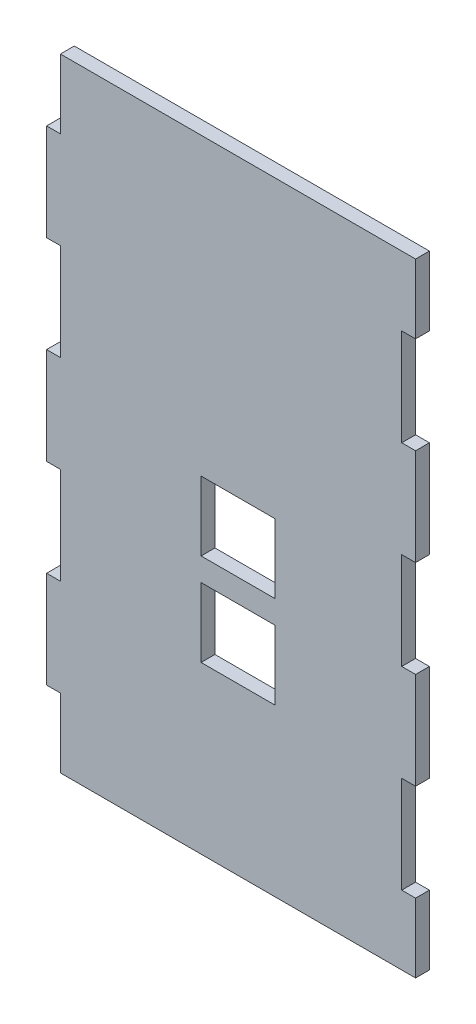
ISO-10303-21;
HEADER;
FILE_DESCRIPTION(('STEP AP214'),'2;1');
FILE_NAME('part.step','',(''),(''),'','','');
FILE_SCHEMA(('AUTOMOTIVE_DESIGN { 1 0 10303 214 1 1 1 1 }'));
ENDSEC;
DATA;
#1=APPLICATION_CONTEXT('core data for automotive mechanical design processes');
#2=APPLICATION_PROTOCOL_DEFINITION('international standard','automotive_design',2000,#1);
#3=PRODUCT_CONTEXT('',#1,'mechanical');
#4=PRODUCT('Part','Part','',(#3));
#5=PRODUCT_RELATED_PRODUCT_CATEGORY('part','',(#4));
#6=PRODUCT_DEFINITION_FORMATION('','',#4);
#7=PRODUCT_DEFINITION_CONTEXT('part definition',#1,'design');
#8=PRODUCT_DEFINITION('design','',#6,#7);
#9=PRODUCT_DEFINITION_SHAPE('','',#8);
#10=(LENGTH_UNIT() NAMED_UNIT(*) SI_UNIT(.MILLI.,.METRE.));
#11=(NAMED_UNIT(*) PLANE_ANGLE_UNIT() SI_UNIT($,.RADIAN.));
#12=(NAMED_UNIT(*) SI_UNIT($,.STERADIAN.) SOLID_ANGLE_UNIT());
#13=UNCERTAINTY_MEASURE_WITH_UNIT(LENGTH_MEASURE(1.E-05),#10,'distance_accuracy_value','');
#14=(GEOMETRIC_REPRESENTATION_CONTEXT(3) GLOBAL_UNCERTAINTY_ASSIGNED_CONTEXT((#13)) GLOBAL_UNIT_ASSIGNED_CONTEXT((#10,
#11,#12)) REPRESENTATION_CONTEXT('',''));
#15=CARTESIAN_POINT('',(0.,0.,0.));
#16=DIRECTION('',(0.,0.,1.));
#17=DIRECTION('',(1.,0.,0.));
#18=AXIS2_PLACEMENT_3D('',#15,#16,#17);
#19=CARTESIAN_POINT('',(-38.5,-67.5,3.));
#20=DIRECTION('',(1.,0.,0.));
#21=DIRECTION('',(0.,0.,-1.));
#22=AXIS2_PLACEMENT_3D('',#19,#20,#21);
#23=PLANE('',#22);
#24=DIRECTION('',(0.,-1.,0.));
#25=VECTOR('',#24,1.);
#26=CARTESIAN_POINT('',(-38.5,-67.5,3.));
#27=LINE('',#26,#25);
#28=CARTESIAN_POINT('',(-38.5,-52.5,3.));
#29=VERTEX_POINT('',#28);
#30=CARTESIAN_POINT('',(-38.5,-67.5,3.));
#31=VERTEX_POINT('',#30);
#32=EDGE_CURVE('E590',#29,#31,#27,.T.);
#33=ORIENTED_EDGE('',*,*,#32,.F.);
#34=DIRECTION('',(0.,0.,1.));
#35=VECTOR('',#34,1.);
#36=CARTESIAN_POINT('',(-38.5,-52.5,0.));
#37=LINE('',#36,#35);
#38=CARTESIAN_POINT('',(-38.5,-52.5,0.));
#39=VERTEX_POINT('',#38);
#40=EDGE_CURVE('E390',#39,#29,#37,.T.);
#41=ORIENTED_EDGE('',*,*,#40,.F.);
#42=DIRECTION('',(0.,-1.,0.));
#43=VECTOR('',#42,1.);
#44=CARTESIAN_POINT('',(-38.5,-67.5,0.));
#45=LINE('',#44,#43);
#46=CARTESIAN_POINT('',(-38.5,-67.5,0.));
#47=VERTEX_POINT('',#46);
#48=EDGE_CURVE('E505',#39,#47,#45,.T.);
#49=ORIENTED_EDGE('',*,*,#48,.T.);
#50=DIRECTION('',(0.,0.,-1.));
#51=VECTOR('',#50,1.);
#52=CARTESIAN_POINT('',(-38.5,-67.5,3.));
#53=LINE('',#52,#51);
#54=EDGE_CURVE('E11',#31,#47,#53,.T.);
#55=ORIENTED_EDGE('',*,*,#54,.F.);
#56=EDGE_LOOP('',(#33,#41,#49,#55));
#57=FACE_BOUND('',#56,.T.);
#58=ADVANCED_FACE('F42',(#57),#23,.F.);
#59=CARTESIAN_POINT('',(-38.5,-10.5,0.));
#60=VERTEX_POINT('',#59);
#61=CARTESIAN_POINT('',(-38.5,-31.5,0.));
#62=VERTEX_POINT('',#61);
#63=EDGE_CURVE('E655',#60,#62,#45,.T.);
#64=ORIENTED_EDGE('',*,*,#63,.T.);
#65=DIRECTION('',(0.,0.,1.));
#66=VECTOR('',#65,1.);
#67=CARTESIAN_POINT('',(-38.5,-31.5,0.));
#68=LINE('',#67,#66);
#69=CARTESIAN_POINT('',(-38.5,-31.5,3.));
#70=VERTEX_POINT('',#69);
#71=EDGE_CURVE('E379',#62,#70,#68,.T.);
#72=ORIENTED_EDGE('',*,*,#71,.T.);
#73=CARTESIAN_POINT('',(-38.5,-10.5,3.));
#74=VERTEX_POINT('',#73);
#75=EDGE_CURVE('E681',#74,#70,#27,.T.);
#76=ORIENTED_EDGE('',*,*,#75,.F.);
#77=DIRECTION('',(0.,0.,1.));
#78=VECTOR('',#77,1.);
#79=CARTESIAN_POINT('',(-38.5,-10.5,0.));
#80=LINE('',#79,#78);
#81=EDGE_CURVE('E427',#60,#74,#80,.T.);
#82=ORIENTED_EDGE('',*,*,#81,.F.);
#83=EDGE_LOOP('',(#64,#72,#76,#82));
#84=FACE_BOUND('',#83,.T.);
#85=ADVANCED_FACE('F757',(#84),#23,.F.);
#86=CARTESIAN_POINT('',(-38.5,31.5,0.));
#87=VERTEX_POINT('',#86);
#88=CARTESIAN_POINT('',(-38.5,10.5,0.));
#89=VERTEX_POINT('',#88);
#90=EDGE_CURVE('E608',#87,#89,#45,.T.);
#91=ORIENTED_EDGE('',*,*,#90,.T.);
#92=DIRECTION('',(0.,0.,1.));
#93=VECTOR('',#92,1.);
#94=CARTESIAN_POINT('',(-38.5,10.5,0.));
#95=LINE('',#94,#93);
#96=CARTESIAN_POINT('',(-38.5,10.5,3.));
#97=VERTEX_POINT('',#96);
#98=EDGE_CURVE('E416',#89,#97,#95,.T.);
#99=ORIENTED_EDGE('',*,*,#98,.T.);
#100=CARTESIAN_POINT('',(-38.5,31.5,3.));
#101=VERTEX_POINT('',#100);
#102=EDGE_CURVE('E589',#101,#97,#27,.T.);
#103=ORIENTED_EDGE('',*,*,#102,.F.);
#104=DIRECTION('',(0.,0.,1.));
#105=VECTOR('',#104,1.);
#106=CARTESIAN_POINT('',(-38.5,31.5,0.));
#107=LINE('',#106,#105);
#108=EDGE_CURVE('E463',#87,#101,#107,.T.);
#109=ORIENTED_EDGE('',*,*,#108,.F.);
#110=EDGE_LOOP('',(#91,#99,#103,#109));
#111=FACE_BOUND('',#110,.T.);
#112=ADVANCED_FACE('F665',(#111),#23,.F.);
#113=CARTESIAN_POINT('',(38.5,-67.5,3.));
#114=DIRECTION('',(-1.,0.,0.));
#115=DIRECTION('',(0.,0.,1.));
#116=AXIS2_PLACEMENT_3D('',#113,#114,#115);
#117=PLANE('',#116);
#118=DIRECTION('',(0.,1.,0.));
#119=VECTOR('',#118,1.);
#120=CARTESIAN_POINT('',(38.5,-67.5,0.));
#121=LINE('',#120,#119);
#122=CARTESIAN_POINT('',(38.5,10.5,0.));
#123=VERTEX_POINT('',#122);
#124=CARTESIAN_POINT('',(38.5,31.5,0.));
#125=VERTEX_POINT('',#124);
#126=EDGE_CURVE('E689',#123,#125,#121,.T.);
#127=ORIENTED_EDGE('',*,*,#126,.T.);
#128=DIRECTION('',(0.,0.,1.));
#129=VECTOR('',#128,1.);
#130=CARTESIAN_POINT('',(38.5,31.5,0.));
#131=LINE('',#130,#129);
#132=CARTESIAN_POINT('',(38.5,31.5,3.));
#133=VERTEX_POINT('',#132);
#134=EDGE_CURVE('E501',#125,#133,#131,.T.);
#135=ORIENTED_EDGE('',*,*,#134,.T.);
#136=DIRECTION('',(0.,1.,0.));
#137=VECTOR('',#136,1.);
#138=CARTESIAN_POINT('',(38.5,-67.5,3.));
#139=LINE('',#138,#137);
#140=CARTESIAN_POINT('',(38.5,10.5,3.));
#141=VERTEX_POINT('',#140);
#142=EDGE_CURVE('E711',#141,#133,#139,.T.);
#143=ORIENTED_EDGE('',*,*,#142,.F.);
#144=DIRECTION('',(0.,0.,1.));
#145=VECTOR('',#144,1.);
#146=CARTESIAN_POINT('',(38.5,10.5,0.));
#147=LINE('',#146,#145);
#148=EDGE_CURVE('E495',#123,#141,#147,.T.);
#149=ORIENTED_EDGE('',*,*,#148,.F.);
#150=EDGE_LOOP('',(#127,#135,#143,#149));
#151=FACE_BOUND('',#150,.T.);
#152=ADVANCED_FACE('F735',(#151),#117,.F.);
#153=CARTESIAN_POINT('',(38.5,52.5,3.));
#154=VERTEX_POINT('',#153);
#155=CARTESIAN_POINT('',(38.5,67.5,3.));
#156=VERTEX_POINT('',#155);
#157=EDGE_CURVE('E593',#154,#156,#139,.T.);
#158=ORIENTED_EDGE('',*,*,#157,.F.);
#159=DIRECTION('',(0.,0.,1.));
#160=VECTOR('',#159,1.);
#161=CARTESIAN_POINT('',(38.5,52.5,0.));
#162=LINE('',#161,#160);
#163=CARTESIAN_POINT('',(38.5,52.5,0.));
#164=VERTEX_POINT('',#163);
#165=EDGE_CURVE('E489',#164,#154,#162,.T.);
#166=ORIENTED_EDGE('',*,*,#165,.F.);
#167=CARTESIAN_POINT('',(38.5,67.5,0.));
#168=VERTEX_POINT('',#167);
#169=EDGE_CURVE('E611',#164,#168,#121,.T.);
#170=ORIENTED_EDGE('',*,*,#169,.T.);
#171=DIRECTION('',(0.,0.,-1.));
#172=VECTOR('',#171,1.);
#173=CARTESIAN_POINT('',(38.5,67.5,3.));
#174=LINE('',#173,#172);
#175=EDGE_CURVE('E623',#156,#168,#174,.T.);
#176=ORIENTED_EDGE('',*,*,#175,.F.);
#177=EDGE_LOOP('',(#158,#166,#170,#176));
#178=FACE_BOUND('',#177,.T.);
#179=ADVANCED_FACE('F697',(#178),#117,.F.);
#180=CARTESIAN_POINT('',(38.5,-31.5,0.));
#181=VERTEX_POINT('',#180);
#182=CARTESIAN_POINT('',(38.5,-10.5,0.));
#183=VERTEX_POINT('',#182);
#184=EDGE_CURVE('E617',#181,#183,#121,.T.);
#185=ORIENTED_EDGE('',*,*,#184,.T.);
#186=DIRECTION('',(0.,0.,1.));
#187=VECTOR('',#186,1.);
#188=CARTESIAN_POINT('',(38.5,-10.5,0.));
#189=LINE('',#188,#187);
#190=CARTESIAN_POINT('',(38.5,-10.5,3.));
#191=VERTEX_POINT('',#190);
#192=EDGE_CURVE('E541',#183,#191,#189,.T.);
#193=ORIENTED_EDGE('',*,*,#192,.T.);
#194=CARTESIAN_POINT('',(38.5,-31.5,3.));
#195=VERTEX_POINT('',#194);
#196=EDGE_CURVE('E599',#195,#191,#139,.T.);
#197=ORIENTED_EDGE('',*,*,#196,.F.);
#198=DIRECTION('',(0.,0.,1.));
#199=VECTOR('',#198,1.);
#200=CARTESIAN_POINT('',(38.5,-31.5,0.));
#201=LINE('',#200,#199);
#202=EDGE_CURVE('E533',#181,#195,#201,.T.);
#203=ORIENTED_EDGE('',*,*,#202,.F.);
#204=EDGE_LOOP('',(#185,#193,#197,#203));
#205=FACE_BOUND('',#204,.T.);
#206=ADVANCED_FACE('F723',(#205),#117,.F.);
#207=CARTESIAN_POINT('',(-38.5,67.5,0.));
#208=VERTEX_POINT('',#207);
#209=CARTESIAN_POINT('',(-38.5,52.5,0.));
#210=VERTEX_POINT('',#209);
#211=EDGE_CURVE('E603',#208,#210,#45,.T.);
#212=ORIENTED_EDGE('',*,*,#211,.T.);
#213=DIRECTION('',(0.,0.,1.));
#214=VECTOR('',#213,1.);
#215=CARTESIAN_POINT('',(-38.5,52.5,0.));
#216=LINE('',#215,#214);
#217=CARTESIAN_POINT('',(-38.5,52.5,3.));
#218=VERTEX_POINT('',#217);
#219=EDGE_CURVE('E452',#210,#218,#216,.T.);
#220=ORIENTED_EDGE('',*,*,#219,.T.);
#221=CARTESIAN_POINT('',(-38.5,67.5,3.));
#222=VERTEX_POINT('',#221);
#223=EDGE_CURVE('E584',#222,#218,#27,.T.);
#224=ORIENTED_EDGE('',*,*,#223,.F.);
#225=DIRECTION('',(0.,0.,-1.));
#226=VECTOR('',#225,1.);
#227=CARTESIAN_POINT('',(-38.5,67.5,3.));
#228=LINE('',#227,#226);
#229=EDGE_CURVE('E602',#222,#208,#228,.T.);
#230=ORIENTED_EDGE('',*,*,#229,.T.);
#231=EDGE_LOOP('',(#212,#220,#224,#230));
#232=FACE_BOUND('',#231,.T.);
#233=ADVANCED_FACE('F44',(#232),#23,.F.);
#234=CARTESIAN_POINT('',(38.5,-67.5,3.));
#235=DIRECTION('',(0.,1.,0.));
#236=DIRECTION('',(-1.,0.,0.));
#237=AXIS2_PLACEMENT_3D('',#234,#235,#236);
#238=PLANE('',#237);
#239=DIRECTION('',(1.,0.,0.));
#240=VECTOR('',#239,1.);
#241=CARTESIAN_POINT('',(38.5,-67.5,0.));
#242=LINE('',#241,#240);
#243=CARTESIAN_POINT('',(38.5,-67.5,0.));
#244=VERTEX_POINT('',#243);
#245=EDGE_CURVE('E607',#47,#244,#242,.T.);
#246=ORIENTED_EDGE('',*,*,#245,.T.);
#247=DIRECTION('',(0.,0.,-1.));
#248=VECTOR('',#247,1.);
#249=CARTESIAN_POINT('',(38.5,-67.5,3.));
#250=LINE('',#249,#248);
#251=CARTESIAN_POINT('',(38.5,-67.5,3.));
#252=VERTEX_POINT('',#251);
#253=EDGE_CURVE('E51',#252,#244,#250,.T.);
#254=ORIENTED_EDGE('',*,*,#253,.F.);
#255=DIRECTION('',(1.,0.,0.));
#256=VECTOR('',#255,1.);
#257=CARTESIAN_POINT('',(38.5,-67.5,3.));
#258=LINE('',#257,#256);
#259=EDGE_CURVE('E588',#31,#252,#258,.T.);
#260=ORIENTED_EDGE('',*,*,#259,.F.);
#261=ORIENTED_EDGE('',*,*,#54,.T.);
#262=EDGE_LOOP('',(#246,#254,#260,#261));
#263=FACE_BOUND('',#262,.T.);
#264=ADVANCED_FACE('F650',(#263),#238,.F.);
#265=CARTESIAN_POINT('',(38.5,-52.5,0.));
#266=VERTEX_POINT('',#265);
#267=EDGE_CURVE('E612',#244,#266,#121,.T.);
#268=ORIENTED_EDGE('',*,*,#267,.T.);
#269=DIRECTION('',(0.,0.,1.));
#270=VECTOR('',#269,1.);
#271=CARTESIAN_POINT('',(38.5,-52.5,0.));
#272=LINE('',#271,#270);
#273=CARTESIAN_POINT('',(38.5,-52.5,3.));
#274=VERTEX_POINT('',#273);
#275=EDGE_CURVE('E575',#266,#274,#272,.T.);
#276=ORIENTED_EDGE('',*,*,#275,.T.);
#277=EDGE_CURVE('E594',#252,#274,#139,.T.);
#278=ORIENTED_EDGE('',*,*,#277,.F.);
#279=ORIENTED_EDGE('',*,*,#253,.T.);
#280=EDGE_LOOP('',(#268,#276,#278,#279));
#281=FACE_BOUND('',#280,.T.);
#282=ADVANCED_FACE('F632',(#281),#117,.F.);
#283=CARTESIAN_POINT('',(38.5,67.5,3.));
#284=DIRECTION('',(0.,-1.,0.));
#285=DIRECTION('',(1.,0.,0.));
#286=AXIS2_PLACEMENT_3D('',#283,#284,#285);
#287=PLANE('',#286);
#288=DIRECTION('',(-1.,0.,0.));
#289=VECTOR('',#288,1.);
#290=CARTESIAN_POINT('',(38.5,67.5,0.));
#291=LINE('',#290,#289);
#292=EDGE_CURVE('E616',#168,#208,#291,.T.);
#293=ORIENTED_EDGE('',*,*,#292,.T.);
#294=ORIENTED_EDGE('',*,*,#229,.F.);
#295=DIRECTION('',(-1.,0.,0.));
#296=VECTOR('',#295,1.);
#297=CARTESIAN_POINT('',(38.5,67.5,3.));
#298=LINE('',#297,#296);
#299=EDGE_CURVE('E598',#156,#222,#298,.T.);
#300=ORIENTED_EDGE('',*,*,#299,.F.);
#301=ORIENTED_EDGE('',*,*,#175,.T.);
#302=EDGE_LOOP('',(#293,#294,#300,#301));
#303=FACE_BOUND('',#302,.T.);
#304=ADVANCED_FACE('F701',(#303),#287,.F.);
#305=CARTESIAN_POINT('',(0.,0.,3.));
#306=DIRECTION('',(0.,0.,1.));
#307=DIRECTION('',(1.,0.,0.));
#308=AXIS2_PLACEMENT_3D('',#305,#306,#307);
#309=PLANE('',#308);
#310=DIRECTION('',(0.,-1.,0.));
#311=VECTOR('',#310,1.);
#312=CARTESIAN_POINT('',(-8.,3.49999999999998,3.));
#313=LINE('',#312,#311);
#314=CARTESIAN_POINT('',(-8.,3.49999999999998,3.));
#315=VERTEX_POINT('',#314);
#316=CARTESIAN_POINT('',(-8.,-11.5,3.));
#317=VERTEX_POINT('',#316);
#318=EDGE_CURVE('E58',#315,#317,#313,.T.);
#319=ORIENTED_EDGE('',*,*,#318,.F.);
#320=DIRECTION('',(1.,0.,0.));
#321=VECTOR('',#320,1.);
#322=CARTESIAN_POINT('',(-8.,3.49999999999998,3.));
#323=LINE('',#322,#321);
#324=CARTESIAN_POINT('',(8.,3.49999999999998,3.));
#325=VERTEX_POINT('',#324);
#326=EDGE_CURVE('E295',#315,#325,#323,.T.);
#327=ORIENTED_EDGE('',*,*,#326,.T.);
#328=DIRECTION('',(0.,-1.,0.));
#329=VECTOR('',#328,1.);
#330=CARTESIAN_POINT('',(8.,3.49999999999998,3.));
#331=LINE('',#330,#329);
#332=CARTESIAN_POINT('',(8.,-11.5,3.));
#333=VERTEX_POINT('',#332);
#334=EDGE_CURVE('E299',#325,#333,#331,.T.);
#335=ORIENTED_EDGE('',*,*,#334,.T.);
#336=DIRECTION('',(1.,0.,0.));
#337=VECTOR('',#336,1.);
#338=CARTESIAN_POINT('',(-8.,-11.5,3.));
#339=LINE('',#338,#337);
#340=EDGE_CURVE('E308',#317,#333,#339,.T.);
#341=ORIENTED_EDGE('',*,*,#340,.F.);
#342=EDGE_LOOP('',(#319,#327,#335,#341));
#343=FACE_BOUND('',#342,.T.);
#344=DIRECTION('',(0.,-1.,0.));
#345=VECTOR('',#344,1.);
#346=CARTESIAN_POINT('',(-8.,-16.5,3.));
#347=LINE('',#346,#345);
#348=CARTESIAN_POINT('',(-8.,-16.5,3.));
#349=VERTEX_POINT('',#348);
#350=CARTESIAN_POINT('',(-8.,-31.5,3.));
#351=VERTEX_POINT('',#350);
#352=EDGE_CURVE('E317',#349,#351,#347,.T.);
#353=ORIENTED_EDGE('',*,*,#352,.F.);
#354=DIRECTION('',(1.,0.,0.));
#355=VECTOR('',#354,1.);
#356=CARTESIAN_POINT('',(-8.,-16.5,3.));
#357=LINE('',#356,#355);
#358=CARTESIAN_POINT('',(8.,-16.5,3.));
#359=VERTEX_POINT('',#358);
#360=EDGE_CURVE('E328',#349,#359,#357,.T.);
#361=ORIENTED_EDGE('',*,*,#360,.T.);
#362=DIRECTION('',(0.,-1.,0.));
#363=VECTOR('',#362,1.);
#364=CARTESIAN_POINT('',(8.,-16.5,3.));
#365=LINE('',#364,#363);
#366=CARTESIAN_POINT('',(8.,-31.5,3.));
#367=VERTEX_POINT('',#366);
#368=EDGE_CURVE('E346',#359,#367,#365,.T.);
#369=ORIENTED_EDGE('',*,*,#368,.T.);
#370=DIRECTION('',(1.,0.,0.));
#371=VECTOR('',#370,1.);
#372=CARTESIAN_POINT('',(-8.,-31.5,3.));
#373=LINE('',#372,#371);
#374=EDGE_CURVE('E342',#351,#367,#373,.T.);
#375=ORIENTED_EDGE('',*,*,#374,.F.);
#376=EDGE_LOOP('',(#353,#361,#369,#375));
#377=FACE_BOUND('',#376,.T.);
#378=DIRECTION('',(1.,0.,0.));
#379=VECTOR('',#378,1.);
#380=CARTESIAN_POINT('',(38.5,31.5,3.));
#381=LINE('',#380,#379);
#382=CARTESIAN_POINT('',(35.5,31.5,3.));
#383=VERTEX_POINT('',#382);
#384=EDGE_CURVE('E481',#383,#133,#381,.T.);
#385=ORIENTED_EDGE('',*,*,#384,.F.);
#386=DIRECTION('',(0.,-1.,0.));
#387=VECTOR('',#386,1.);
#388=CARTESIAN_POINT('',(35.5,52.5,3.));
#389=LINE('',#388,#387);
#390=CARTESIAN_POINT('',(35.5,52.5,3.));
#391=VERTEX_POINT('',#390);
#392=EDGE_CURVE('E494',#391,#383,#389,.T.);
#393=ORIENTED_EDGE('',*,*,#392,.F.);
#394=DIRECTION('',(-1.,0.,0.));
#395=VECTOR('',#394,1.);
#396=CARTESIAN_POINT('',(38.5,52.5,3.));
#397=LINE('',#396,#395);
#398=EDGE_CURVE('E490',#154,#391,#397,.T.);
#399=ORIENTED_EDGE('',*,*,#398,.F.);
#400=ORIENTED_EDGE('',*,*,#157,.T.);
#401=ORIENTED_EDGE('',*,*,#299,.T.);
#402=ORIENTED_EDGE('',*,*,#223,.T.);
#403=DIRECTION('',(-1.,0.,0.));
#404=VECTOR('',#403,1.);
#405=CARTESIAN_POINT('',(-38.5,52.5,3.));
#406=LINE('',#405,#404);
#407=CARTESIAN_POINT('',(-41.5,52.5,3.));
#408=VERTEX_POINT('',#407);
#409=EDGE_CURVE('E431',#218,#408,#406,.T.);
#410=ORIENTED_EDGE('',*,*,#409,.T.);
#411=DIRECTION('',(0.,-1.,0.));
#412=VECTOR('',#411,1.);
#413=CARTESIAN_POINT('',(-41.5,52.5,3.));
#414=LINE('',#413,#412);
#415=CARTESIAN_POINT('',(-41.5,31.5,3.));
#416=VERTEX_POINT('',#415);
#417=EDGE_CURVE('E456',#408,#416,#414,.T.);
#418=ORIENTED_EDGE('',*,*,#417,.T.);
#419=DIRECTION('',(1.,0.,0.));
#420=VECTOR('',#419,1.);
#421=CARTESIAN_POINT('',(-38.5,31.5,3.));
#422=LINE('',#421,#420);
#423=EDGE_CURVE('E445',#416,#101,#422,.T.);
#424=ORIENTED_EDGE('',*,*,#423,.T.);
#425=ORIENTED_EDGE('',*,*,#102,.T.);
#426=DIRECTION('',(-1.,0.,0.));
#427=VECTOR('',#426,1.);
#428=CARTESIAN_POINT('',(-38.5,10.5,3.));
#429=LINE('',#428,#427);
#430=CARTESIAN_POINT('',(-41.5,10.5,3.));
#431=VERTEX_POINT('',#430);
#432=EDGE_CURVE('E394',#97,#431,#429,.T.);
#433=ORIENTED_EDGE('',*,*,#432,.T.);
#434=DIRECTION('',(0.,-1.,0.));
#435=VECTOR('',#434,1.);
#436=CARTESIAN_POINT('',(-41.5,10.5,3.));
#437=LINE('',#436,#435);
#438=CARTESIAN_POINT('',(-41.5,-10.5,3.));
#439=VERTEX_POINT('',#438);
#440=EDGE_CURVE('E420',#431,#439,#437,.T.);
#441=ORIENTED_EDGE('',*,*,#440,.T.);
#442=DIRECTION('',(1.,0.,0.));
#443=VECTOR('',#442,1.);
#444=CARTESIAN_POINT('',(-38.5,-10.5,3.));
#445=LINE('',#444,#443);
#446=EDGE_CURVE('E408',#439,#74,#445,.T.);
#447=ORIENTED_EDGE('',*,*,#446,.T.);
#448=ORIENTED_EDGE('',*,*,#75,.T.);
#449=DIRECTION('',(-1.,0.,0.));
#450=VECTOR('',#449,1.);
#451=CARTESIAN_POINT('',(-38.5,-31.5,3.));
#452=LINE('',#451,#450);
#453=CARTESIAN_POINT('',(-41.5,-31.5,3.));
#454=VERTEX_POINT('',#453);
#455=EDGE_CURVE('E356',#70,#454,#452,.T.);
#456=ORIENTED_EDGE('',*,*,#455,.T.);
#457=DIRECTION('',(0.,-1.,0.));
#458=VECTOR('',#457,1.);
#459=CARTESIAN_POINT('',(-41.5,-31.5,3.));
#460=LINE('',#459,#458);
#461=CARTESIAN_POINT('',(-41.5,-52.5,3.));
#462=VERTEX_POINT('',#461);
#463=EDGE_CURVE('E383',#454,#462,#460,.T.);
#464=ORIENTED_EDGE('',*,*,#463,.T.);
#465=DIRECTION('',(1.,0.,0.));
#466=VECTOR('',#465,1.);
#467=CARTESIAN_POINT('',(-38.5,-52.5,3.));
#468=LINE('',#467,#466);
#469=EDGE_CURVE('E371',#462,#29,#468,.T.);
#470=ORIENTED_EDGE('',*,*,#469,.T.);
#471=ORIENTED_EDGE('',*,*,#32,.T.);
#472=ORIENTED_EDGE('',*,*,#259,.T.);
#473=ORIENTED_EDGE('',*,*,#277,.T.);
#474=DIRECTION('',(1.,0.,0.));
#475=VECTOR('',#474,1.);
#476=CARTESIAN_POINT('',(38.5,-52.5,3.));
#477=LINE('',#476,#475);
#478=CARTESIAN_POINT('',(35.5,-52.5,3.));
#479=VERTEX_POINT('',#478);
#480=EDGE_CURVE('E555',#479,#274,#477,.T.);
#481=ORIENTED_EDGE('',*,*,#480,.F.);
#482=DIRECTION('',(0.,-1.,0.));
#483=VECTOR('',#482,1.);
#484=CARTESIAN_POINT('',(35.5,-31.5,3.));
#485=LINE('',#484,#483);
#486=CARTESIAN_POINT('',(35.5,-31.5,3.));
#487=VERTEX_POINT('',#486);
#488=EDGE_CURVE('E567',#487,#479,#485,.T.);
#489=ORIENTED_EDGE('',*,*,#488,.F.);
#490=DIRECTION('',(-1.,0.,0.));
#491=VECTOR('',#490,1.);
#492=CARTESIAN_POINT('',(38.5,-31.5,3.));
#493=LINE('',#492,#491);
#494=EDGE_CURVE('E466',#195,#487,#493,.T.);
#495=ORIENTED_EDGE('',*,*,#494,.F.);
#496=ORIENTED_EDGE('',*,*,#196,.T.);
#497=DIRECTION('',(1.,0.,0.));
#498=VECTOR('',#497,1.);
#499=CARTESIAN_POINT('',(38.5,-10.5,3.));
#500=LINE('',#499,#498);
#501=CARTESIAN_POINT('',(35.5,-10.5,3.));
#502=VERTEX_POINT('',#501);
#503=EDGE_CURVE('E519',#502,#191,#500,.T.);
#504=ORIENTED_EDGE('',*,*,#503,.F.);
#505=DIRECTION('',(0.,-1.,0.));
#506=VECTOR('',#505,1.);
#507=CARTESIAN_POINT('',(35.5,10.5,3.));
#508=LINE('',#507,#506);
#509=CARTESIAN_POINT('',(35.5,10.5,3.));
#510=VERTEX_POINT('',#509);
#511=EDGE_CURVE('E532',#510,#502,#508,.T.);
#512=ORIENTED_EDGE('',*,*,#511,.F.);
#513=DIRECTION('',(-1.,0.,0.));
#514=VECTOR('',#513,1.);
#515=CARTESIAN_POINT('',(38.5,10.5,3.));
#516=LINE('',#515,#514);
#517=EDGE_CURVE('E528',#141,#510,#516,.T.);
#518=ORIENTED_EDGE('',*,*,#517,.F.);
#519=ORIENTED_EDGE('',*,*,#142,.T.);
#520=EDGE_LOOP('',(#385,#393,#399,#400,#401,#402,#410,#418,#424,#425,#433,#441,#447,#448,#456,
#464,#470,#471,#472,#473,#481,#489,#495,#496,#504,#512,#518,#519));
#521=FACE_BOUND('',#520,.T.);
#522=ADVANCED_FACE('F648',(#343,#377,#521),#309,.T.);
#523=CARTESIAN_POINT('',(0.,0.,0.));
#524=DIRECTION('',(0.,0.,1.));
#525=DIRECTION('',(1.,0.,0.));
#526=AXIS2_PLACEMENT_3D('',#523,#524,#525);
#527=PLANE('',#526);
#528=DIRECTION('',(1.,0.,0.));
#529=VECTOR('',#528,1.);
#530=CARTESIAN_POINT('',(-8.,3.49999999999998,0.));
#531=LINE('',#530,#529);
#532=CARTESIAN_POINT('',(-8.,3.49999999999998,0.));
#533=VERTEX_POINT('',#532);
#534=CARTESIAN_POINT('',(8.,3.49999999999998,0.));
#535=VERTEX_POINT('',#534);
#536=EDGE_CURVE('E282',#533,#535,#531,.T.);
#537=ORIENTED_EDGE('',*,*,#536,.F.);
#538=DIRECTION('',(0.,-1.,0.));
#539=VECTOR('',#538,1.);
#540=CARTESIAN_POINT('',(-8.,3.49999999999998,0.));
#541=LINE('',#540,#539);
#542=CARTESIAN_POINT('',(-8.,-11.5,0.));
#543=VERTEX_POINT('',#542);
#544=EDGE_CURVE('E278',#533,#543,#541,.T.);
#545=ORIENTED_EDGE('',*,*,#544,.T.);
#546=DIRECTION('',(1.,0.,0.));
#547=VECTOR('',#546,1.);
#548=CARTESIAN_POINT('',(-8.,-11.5,0.));
#549=LINE('',#548,#547);
#550=CARTESIAN_POINT('',(8.,-11.5,0.));
#551=VERTEX_POINT('',#550);
#552=EDGE_CURVE('E285',#543,#551,#549,.T.);
#553=ORIENTED_EDGE('',*,*,#552,.T.);
#554=DIRECTION('',(0.,-1.,0.));
#555=VECTOR('',#554,1.);
#556=CARTESIAN_POINT('',(8.,3.49999999999998,0.));
#557=LINE('',#556,#555);
#558=EDGE_CURVE('E290',#535,#551,#557,.T.);
#559=ORIENTED_EDGE('',*,*,#558,.F.);
#560=EDGE_LOOP('',(#537,#545,#553,#559));
#561=FACE_BOUND('',#560,.T.);
#562=DIRECTION('',(1.,0.,0.));
#563=VECTOR('',#562,1.);
#564=CARTESIAN_POINT('',(-8.,-16.5,0.));
#565=LINE('',#564,#563);
#566=CARTESIAN_POINT('',(-8.,-16.5,0.));
#567=VERTEX_POINT('',#566);
#568=CARTESIAN_POINT('',(8.,-16.5,0.));
#569=VERTEX_POINT('',#568);
#570=EDGE_CURVE('E336',#567,#569,#565,.T.);
#571=ORIENTED_EDGE('',*,*,#570,.F.);
#572=DIRECTION('',(0.,-1.,0.));
#573=VECTOR('',#572,1.);
#574=CARTESIAN_POINT('',(-8.,-16.5,0.));
#575=LINE('',#574,#573);
#576=CARTESIAN_POINT('',(-8.,-31.5,0.));
#577=VERTEX_POINT('',#576);
#578=EDGE_CURVE('E323',#567,#577,#575,.T.);
#579=ORIENTED_EDGE('',*,*,#578,.T.);
#580=DIRECTION('',(1.,0.,0.));
#581=VECTOR('',#580,1.);
#582=CARTESIAN_POINT('',(-8.,-31.5,0.));
#583=LINE('',#582,#581);
#584=CARTESIAN_POINT('',(8.,-31.5,0.));
#585=VERTEX_POINT('',#584);
#586=EDGE_CURVE('E327',#577,#585,#583,.T.);
#587=ORIENTED_EDGE('',*,*,#586,.T.);
#588=DIRECTION('',(0.,-1.,0.));
#589=VECTOR('',#588,1.);
#590=CARTESIAN_POINT('',(8.,-16.5,0.));
#591=LINE('',#590,#589);
#592=EDGE_CURVE('E332',#569,#585,#591,.T.);
#593=ORIENTED_EDGE('',*,*,#592,.F.);
#594=EDGE_LOOP('',(#571,#579,#587,#593));
#595=FACE_BOUND('',#594,.T.);
#596=DIRECTION('',(0.,-1.,0.));
#597=VECTOR('',#596,1.);
#598=CARTESIAN_POINT('',(35.5,52.5,0.));
#599=LINE('',#598,#597);
#600=CARTESIAN_POINT('',(35.5,52.5,0.));
#601=VERTEX_POINT('',#600);
#602=CARTESIAN_POINT('',(35.5,31.5,0.));
#603=VERTEX_POINT('',#602);
#604=EDGE_CURVE('E480',#601,#603,#599,.T.);
#605=ORIENTED_EDGE('',*,*,#604,.T.);
#606=DIRECTION('',(1.,0.,0.));
#607=VECTOR('',#606,1.);
#608=CARTESIAN_POINT('',(38.5,31.5,0.));
#609=LINE('',#608,#607);
#610=EDGE_CURVE('E485',#603,#125,#609,.T.);
#611=ORIENTED_EDGE('',*,*,#610,.T.);
#612=ORIENTED_EDGE('',*,*,#126,.F.);
#613=DIRECTION('',(-1.,0.,0.));
#614=VECTOR('',#613,1.);
#615=CARTESIAN_POINT('',(38.5,10.5,0.));
#616=LINE('',#615,#614);
#617=CARTESIAN_POINT('',(35.5,10.5,0.));
#618=VERTEX_POINT('',#617);
#619=EDGE_CURVE('E514',#123,#618,#616,.T.);
#620=ORIENTED_EDGE('',*,*,#619,.T.);
#621=DIRECTION('',(0.,-1.,0.));
#622=VECTOR('',#621,1.);
#623=CARTESIAN_POINT('',(35.5,10.5,0.));
#624=LINE('',#623,#622);
#625=CARTESIAN_POINT('',(35.5,-10.5,0.));
#626=VERTEX_POINT('',#625);
#627=EDGE_CURVE('E518',#618,#626,#624,.T.);
#628=ORIENTED_EDGE('',*,*,#627,.T.);
#629=DIRECTION('',(1.,0.,0.));
#630=VECTOR('',#629,1.);
#631=CARTESIAN_POINT('',(38.5,-10.5,0.));
#632=LINE('',#631,#630);
#633=EDGE_CURVE('E523',#626,#183,#632,.T.);
#634=ORIENTED_EDGE('',*,*,#633,.T.);
#635=ORIENTED_EDGE('',*,*,#184,.F.);
#636=DIRECTION('',(-1.,0.,0.));
#637=VECTOR('',#636,1.);
#638=CARTESIAN_POINT('',(38.5,-31.5,0.));
#639=LINE('',#638,#637);
#640=CARTESIAN_POINT('',(35.5,-31.5,0.));
#641=VERTEX_POINT('',#640);
#642=EDGE_CURVE('E550',#181,#641,#639,.T.);
#643=ORIENTED_EDGE('',*,*,#642,.T.);
#644=DIRECTION('',(0.,-1.,0.));
#645=VECTOR('',#644,1.);
#646=CARTESIAN_POINT('',(35.5,-31.5,0.));
#647=LINE('',#646,#645);
#648=CARTESIAN_POINT('',(35.5,-52.5,0.));
#649=VERTEX_POINT('',#648);
#650=EDGE_CURVE('E554',#641,#649,#647,.T.);
#651=ORIENTED_EDGE('',*,*,#650,.T.);
#652=DIRECTION('',(1.,0.,0.));
#653=VECTOR('',#652,1.);
#654=CARTESIAN_POINT('',(38.5,-52.5,0.));
#655=LINE('',#654,#653);
#656=EDGE_CURVE('E559',#649,#266,#655,.T.);
#657=ORIENTED_EDGE('',*,*,#656,.T.);
#658=ORIENTED_EDGE('',*,*,#267,.F.);
#659=ORIENTED_EDGE('',*,*,#245,.F.);
#660=ORIENTED_EDGE('',*,*,#48,.F.);
#661=DIRECTION('',(1.,0.,0.));
#662=VECTOR('',#661,1.);
#663=CARTESIAN_POINT('',(-38.5,-52.5,0.));
#664=LINE('',#663,#662);
#665=CARTESIAN_POINT('',(-41.5,-52.5,0.));
#666=VERTEX_POINT('',#665);
#667=EDGE_CURVE('E375',#666,#39,#664,.T.);
#668=ORIENTED_EDGE('',*,*,#667,.F.);
#669=DIRECTION('',(0.,-1.,0.));
#670=VECTOR('',#669,1.);
#671=CARTESIAN_POINT('',(-41.5,-31.5,0.));
#672=LINE('',#671,#670);
#673=CARTESIAN_POINT('',(-41.5,-31.5,0.));
#674=VERTEX_POINT('',#673);
#675=EDGE_CURVE('E370',#674,#666,#672,.T.);
#676=ORIENTED_EDGE('',*,*,#675,.F.);
#677=DIRECTION('',(-1.,0.,0.));
#678=VECTOR('',#677,1.);
#679=CARTESIAN_POINT('',(-38.5,-31.5,0.));
#680=LINE('',#679,#678);
#681=EDGE_CURVE('E366',#62,#674,#680,.T.);
#682=ORIENTED_EDGE('',*,*,#681,.F.);
#683=ORIENTED_EDGE('',*,*,#63,.F.);
#684=DIRECTION('',(1.,0.,0.));
#685=VECTOR('',#684,1.);
#686=CARTESIAN_POINT('',(-38.5,-10.5,0.));
#687=LINE('',#686,#685);
#688=CARTESIAN_POINT('',(-41.5,-10.5,0.));
#689=VERTEX_POINT('',#688);
#690=EDGE_CURVE('E412',#689,#60,#687,.T.);
#691=ORIENTED_EDGE('',*,*,#690,.F.);
#692=DIRECTION('',(0.,-1.,0.));
#693=VECTOR('',#692,1.);
#694=CARTESIAN_POINT('',(-41.5,10.5,0.));
#695=LINE('',#694,#693);
#696=CARTESIAN_POINT('',(-41.5,10.5,0.));
#697=VERTEX_POINT('',#696);
#698=EDGE_CURVE('E407',#697,#689,#695,.T.);
#699=ORIENTED_EDGE('',*,*,#698,.F.);
#700=DIRECTION('',(-1.,0.,0.));
#701=VECTOR('',#700,1.);
#702=CARTESIAN_POINT('',(-38.5,10.5,0.));
#703=LINE('',#702,#701);
#704=EDGE_CURVE('E403',#89,#697,#703,.T.);
#705=ORIENTED_EDGE('',*,*,#704,.F.);
#706=ORIENTED_EDGE('',*,*,#90,.F.);
#707=DIRECTION('',(1.,0.,0.));
#708=VECTOR('',#707,1.);
#709=CARTESIAN_POINT('',(-38.5,31.5,0.));
#710=LINE('',#709,#708);
#711=CARTESIAN_POINT('',(-41.5,31.5,0.));
#712=VERTEX_POINT('',#711);
#713=EDGE_CURVE('E449',#712,#87,#710,.T.);
#714=ORIENTED_EDGE('',*,*,#713,.F.);
#715=DIRECTION('',(0.,-1.,0.));
#716=VECTOR('',#715,1.);
#717=CARTESIAN_POINT('',(-41.5,52.5,0.));
#718=LINE('',#717,#716);
#719=CARTESIAN_POINT('',(-41.5,52.5,0.));
#720=VERTEX_POINT('',#719);
#721=EDGE_CURVE('E444',#720,#712,#718,.T.);
#722=ORIENTED_EDGE('',*,*,#721,.F.);
#723=DIRECTION('',(-1.,0.,0.));
#724=VECTOR('',#723,1.);
#725=CARTESIAN_POINT('',(-38.5,52.5,0.));
#726=LINE('',#725,#724);
#727=EDGE_CURVE('E440',#210,#720,#726,.T.);
#728=ORIENTED_EDGE('',*,*,#727,.F.);
#729=ORIENTED_EDGE('',*,*,#211,.F.);
#730=ORIENTED_EDGE('',*,*,#292,.F.);
#731=ORIENTED_EDGE('',*,*,#169,.F.);
#732=DIRECTION('',(-1.,0.,0.));
#733=VECTOR('',#732,1.);
#734=CARTESIAN_POINT('',(38.5,52.5,0.));
#735=LINE('',#734,#733);
#736=EDGE_CURVE('E476',#164,#601,#735,.T.);
#737=ORIENTED_EDGE('',*,*,#736,.T.);
#738=EDGE_LOOP('',(#605,#611,#612,#620,#628,#634,#635,#643,#651,#657,#658,#659,#660,#668,#676,
#682,#683,#691,#699,#705,#706,#714,#722,#728,#729,#730,#731,#737));
#739=FACE_BOUND('',#738,.T.);
#740=ADVANCED_FACE('F292',(#561,#595,#739),#527,.F.);
#741=CARTESIAN_POINT('',(38.5,-31.5,0.));
#742=DIRECTION('',(0.,1.,0.));
#743=DIRECTION('',(0.,0.,1.));
#744=AXIS2_PLACEMENT_3D('',#741,#742,#743);
#745=PLANE('',#744);
#746=ORIENTED_EDGE('',*,*,#494,.T.);
#747=DIRECTION('',(0.,0.,1.));
#748=VECTOR('',#747,1.);
#749=CARTESIAN_POINT('',(35.5,-31.5,0.));
#750=LINE('',#749,#748);
#751=EDGE_CURVE('E563',#641,#487,#750,.T.);
#752=ORIENTED_EDGE('',*,*,#751,.F.);
#753=ORIENTED_EDGE('',*,*,#642,.F.);
#754=ORIENTED_EDGE('',*,*,#202,.T.);
#755=EDGE_LOOP('',(#746,#752,#753,#754));
#756=FACE_BOUND('',#755,.T.);
#757=ADVANCED_FACE('F787',(#756),#745,.F.);
#758=CARTESIAN_POINT('',(38.5,-52.5,0.));
#759=DIRECTION('',(0.,-1.,0.));
#760=DIRECTION('',(0.,0.,-1.));
#761=AXIS2_PLACEMENT_3D('',#758,#759,#760);
#762=PLANE('',#761);
#763=ORIENTED_EDGE('',*,*,#480,.T.);
#764=ORIENTED_EDGE('',*,*,#275,.F.);
#765=ORIENTED_EDGE('',*,*,#656,.F.);
#766=DIRECTION('',(0.,0.,1.));
#767=VECTOR('',#766,1.);
#768=CARTESIAN_POINT('',(35.5,-52.5,0.));
#769=LINE('',#768,#767);
#770=EDGE_CURVE('E579',#649,#479,#769,.T.);
#771=ORIENTED_EDGE('',*,*,#770,.T.);
#772=EDGE_LOOP('',(#763,#764,#765,#771));
#773=FACE_BOUND('',#772,.T.);
#774=ADVANCED_FACE('F640',(#773),#762,.F.);
#775=CARTESIAN_POINT('',(35.5,-31.5,0.));
#776=DIRECTION('',(-1.,0.,0.));
#777=DIRECTION('',(0.,-1.,0.));
#778=AXIS2_PLACEMENT_3D('',#775,#776,#777);
#779=PLANE('',#778);
#780=ORIENTED_EDGE('',*,*,#488,.T.);
#781=ORIENTED_EDGE('',*,*,#770,.F.);
#782=ORIENTED_EDGE('',*,*,#650,.F.);
#783=ORIENTED_EDGE('',*,*,#751,.T.);
#784=EDGE_LOOP('',(#780,#781,#782,#783));
#785=FACE_BOUND('',#784,.T.);
#786=ADVANCED_FACE('F642',(#785),#779,.F.);
#787=CARTESIAN_POINT('',(38.5,10.5,0.));
#788=DIRECTION('',(0.,1.,0.));
#789=DIRECTION('',(0.,0.,1.));
#790=AXIS2_PLACEMENT_3D('',#787,#788,#789);
#791=PLANE('',#790);
#792=ORIENTED_EDGE('',*,*,#517,.T.);
#793=DIRECTION('',(0.,0.,1.));
#794=VECTOR('',#793,1.);
#795=CARTESIAN_POINT('',(35.5,10.5,0.));
#796=LINE('',#795,#794);
#797=EDGE_CURVE('E527',#618,#510,#796,.T.);
#798=ORIENTED_EDGE('',*,*,#797,.F.);
#799=ORIENTED_EDGE('',*,*,#619,.F.);
#800=ORIENTED_EDGE('',*,*,#148,.T.);
#801=EDGE_LOOP('',(#792,#798,#799,#800));
#802=FACE_BOUND('',#801,.T.);
#803=ADVANCED_FACE('F794',(#802),#791,.F.);
#804=CARTESIAN_POINT('',(38.5,-10.5,0.));
#805=DIRECTION('',(0.,-1.,0.));
#806=DIRECTION('',(0.,0.,-1.));
#807=AXIS2_PLACEMENT_3D('',#804,#805,#806);
#808=PLANE('',#807);
#809=ORIENTED_EDGE('',*,*,#503,.T.);
#810=ORIENTED_EDGE('',*,*,#192,.F.);
#811=ORIENTED_EDGE('',*,*,#633,.F.);
#812=DIRECTION('',(0.,0.,1.));
#813=VECTOR('',#812,1.);
#814=CARTESIAN_POINT('',(35.5,-10.5,0.));
#815=LINE('',#814,#813);
#816=EDGE_CURVE('E545',#626,#502,#815,.T.);
#817=ORIENTED_EDGE('',*,*,#816,.T.);
#818=EDGE_LOOP('',(#809,#810,#811,#817));
#819=FACE_BOUND('',#818,.T.);
#820=ADVANCED_FACE('F726',(#819),#808,.F.);
#821=CARTESIAN_POINT('',(35.5,10.5,0.));
#822=DIRECTION('',(-1.,0.,0.));
#823=DIRECTION('',(0.,-1.,0.));
#824=AXIS2_PLACEMENT_3D('',#821,#822,#823);
#825=PLANE('',#824);
#826=ORIENTED_EDGE('',*,*,#511,.T.);
#827=ORIENTED_EDGE('',*,*,#816,.F.);
#828=ORIENTED_EDGE('',*,*,#627,.F.);
#829=ORIENTED_EDGE('',*,*,#797,.T.);
#830=EDGE_LOOP('',(#826,#827,#828,#829));
#831=FACE_BOUND('',#830,.T.);
#832=ADVANCED_FACE('F731',(#831),#825,.F.);
#833=CARTESIAN_POINT('',(38.5,31.5,0.));
#834=DIRECTION('',(0.,-1.,0.));
#835=DIRECTION('',(0.,0.,-1.));
#836=AXIS2_PLACEMENT_3D('',#833,#834,#835);
#837=PLANE('',#836);
#838=ORIENTED_EDGE('',*,*,#384,.T.);
#839=ORIENTED_EDGE('',*,*,#134,.F.);
#840=ORIENTED_EDGE('',*,*,#610,.F.);
#841=DIRECTION('',(0.,0.,1.));
#842=VECTOR('',#841,1.);
#843=CARTESIAN_POINT('',(35.5,31.5,0.));
#844=LINE('',#843,#842);
#845=EDGE_CURVE('E506',#603,#383,#844,.T.);
#846=ORIENTED_EDGE('',*,*,#845,.T.);
#847=EDGE_LOOP('',(#838,#839,#840,#846));
#848=FACE_BOUND('',#847,.T.);
#849=ADVANCED_FACE('F738',(#848),#837,.F.);
#850=CARTESIAN_POINT('',(35.5,52.5,0.));
#851=DIRECTION('',(-1.,0.,0.));
#852=DIRECTION('',(0.,-1.,0.));
#853=AXIS2_PLACEMENT_3D('',#850,#851,#852);
#854=PLANE('',#853);
#855=ORIENTED_EDGE('',*,*,#392,.T.);
#856=ORIENTED_EDGE('',*,*,#845,.F.);
#857=ORIENTED_EDGE('',*,*,#604,.F.);
#858=DIRECTION('',(0.,0.,1.));
#859=VECTOR('',#858,1.);
#860=CARTESIAN_POINT('',(35.5,52.5,0.));
#861=LINE('',#860,#859);
#862=EDGE_CURVE('E509',#601,#391,#861,.T.);
#863=ORIENTED_EDGE('',*,*,#862,.T.);
#864=EDGE_LOOP('',(#855,#856,#857,#863));
#865=FACE_BOUND('',#864,.T.);
#866=ADVANCED_FACE('F741',(#865),#854,.F.);
#867=CARTESIAN_POINT('',(38.5,52.5,0.));
#868=DIRECTION('',(0.,1.,0.));
#869=DIRECTION('',(0.,0.,1.));
#870=AXIS2_PLACEMENT_3D('',#867,#868,#869);
#871=PLANE('',#870);
#872=ORIENTED_EDGE('',*,*,#398,.T.);
#873=ORIENTED_EDGE('',*,*,#862,.F.);
#874=ORIENTED_EDGE('',*,*,#736,.F.);
#875=ORIENTED_EDGE('',*,*,#165,.T.);
#876=EDGE_LOOP('',(#872,#873,#874,#875));
#877=FACE_BOUND('',#876,.T.);
#878=ADVANCED_FACE('F743',(#877),#871,.F.);
#879=CARTESIAN_POINT('',(-38.5,31.5,0.));
#880=DIRECTION('',(0.,-1.,0.));
#881=DIRECTION('',(0.,0.,-1.));
#882=AXIS2_PLACEMENT_3D('',#879,#880,#881);
#883=PLANE('',#882);
#884=ORIENTED_EDGE('',*,*,#423,.F.);
#885=DIRECTION('',(0.,0.,1.));
#886=VECTOR('',#885,1.);
#887=CARTESIAN_POINT('',(-41.5,31.5,0.));
#888=LINE('',#887,#886);
#889=EDGE_CURVE('E467',#712,#416,#888,.T.);
#890=ORIENTED_EDGE('',*,*,#889,.F.);
#891=ORIENTED_EDGE('',*,*,#713,.T.);
#892=ORIENTED_EDGE('',*,*,#108,.T.);
#893=EDGE_LOOP('',(#884,#890,#891,#892));
#894=FACE_BOUND('',#893,.T.);
#895=ADVANCED_FACE('F745',(#894),#883,.T.);
#896=CARTESIAN_POINT('',(-41.5,52.5,0.));
#897=DIRECTION('',(-1.,0.,0.));
#898=DIRECTION('',(0.,0.,1.));
#899=AXIS2_PLACEMENT_3D('',#896,#897,#898);
#900=PLANE('',#899);
#901=ORIENTED_EDGE('',*,*,#417,.F.);
#902=DIRECTION('',(0.,0.,1.));
#903=VECTOR('',#902,1.);
#904=CARTESIAN_POINT('',(-41.5,52.5,0.));
#905=LINE('',#904,#903);
#906=EDGE_CURVE('E470',#720,#408,#905,.T.);
#907=ORIENTED_EDGE('',*,*,#906,.F.);
#908=ORIENTED_EDGE('',*,*,#721,.T.);
#909=ORIENTED_EDGE('',*,*,#889,.T.);
#910=EDGE_LOOP('',(#901,#907,#908,#909));
#911=FACE_BOUND('',#910,.T.);
#912=ADVANCED_FACE('F751',(#911),#900,.T.);
#913=CARTESIAN_POINT('',(-38.5,52.5,0.));
#914=DIRECTION('',(0.,1.,0.));
#915=DIRECTION('',(0.,0.,1.));
#916=AXIS2_PLACEMENT_3D('',#913,#914,#915);
#917=PLANE('',#916);
#918=ORIENTED_EDGE('',*,*,#409,.F.);
#919=ORIENTED_EDGE('',*,*,#219,.F.);
#920=ORIENTED_EDGE('',*,*,#727,.T.);
#921=ORIENTED_EDGE('',*,*,#906,.T.);
#922=EDGE_LOOP('',(#918,#919,#920,#921));
#923=FACE_BOUND('',#922,.T.);
#924=ADVANCED_FACE('F846',(#923),#917,.T.);
#925=CARTESIAN_POINT('',(-38.5,-10.5,0.));
#926=DIRECTION('',(0.,-1.,0.));
#927=DIRECTION('',(0.,0.,-1.));
#928=AXIS2_PLACEMENT_3D('',#925,#926,#927);
#929=PLANE('',#928);
#930=ORIENTED_EDGE('',*,*,#446,.F.);
#931=DIRECTION('',(0.,0.,1.));
#932=VECTOR('',#931,1.);
#933=CARTESIAN_POINT('',(-41.5,-10.5,0.));
#934=LINE('',#933,#932);
#935=EDGE_CURVE('E432',#689,#439,#934,.T.);
#936=ORIENTED_EDGE('',*,*,#935,.F.);
#937=ORIENTED_EDGE('',*,*,#690,.T.);
#938=ORIENTED_EDGE('',*,*,#81,.T.);
#939=EDGE_LOOP('',(#930,#936,#937,#938));
#940=FACE_BOUND('',#939,.T.);
#941=ADVANCED_FACE('F856',(#940),#929,.T.);
#942=CARTESIAN_POINT('',(-41.5,10.5,0.));
#943=DIRECTION('',(-1.,0.,0.));
#944=DIRECTION('',(0.,0.,1.));
#945=AXIS2_PLACEMENT_3D('',#942,#943,#944);
#946=PLANE('',#945);
#947=ORIENTED_EDGE('',*,*,#440,.F.);
#948=DIRECTION('',(0.,0.,1.));
#949=VECTOR('',#948,1.);
#950=CARTESIAN_POINT('',(-41.5,10.5,0.));
#951=LINE('',#950,#949);
#952=EDGE_CURVE('E435',#697,#431,#951,.T.);
#953=ORIENTED_EDGE('',*,*,#952,.F.);
#954=ORIENTED_EDGE('',*,*,#698,.T.);
#955=ORIENTED_EDGE('',*,*,#935,.T.);
#956=EDGE_LOOP('',(#947,#953,#954,#955));
#957=FACE_BOUND('',#956,.T.);
#958=ADVANCED_FACE('F677',(#957),#946,.T.);
#959=CARTESIAN_POINT('',(-38.5,10.5,0.));
#960=DIRECTION('',(0.,1.,0.));
#961=DIRECTION('',(0.,0.,1.));
#962=AXIS2_PLACEMENT_3D('',#959,#960,#961);
#963=PLANE('',#962);
#964=ORIENTED_EDGE('',*,*,#432,.F.);
#965=ORIENTED_EDGE('',*,*,#98,.F.);
#966=ORIENTED_EDGE('',*,*,#704,.T.);
#967=ORIENTED_EDGE('',*,*,#952,.T.);
#968=EDGE_LOOP('',(#964,#965,#966,#967));
#969=FACE_BOUND('',#968,.T.);
#970=ADVANCED_FACE('F672',(#969),#963,.T.);
#971=CARTESIAN_POINT('',(-38.5,-52.5,0.));
#972=DIRECTION('',(0.,-1.,0.));
#973=DIRECTION('',(0.,0.,-1.));
#974=AXIS2_PLACEMENT_3D('',#971,#972,#973);
#975=PLANE('',#974);
#976=ORIENTED_EDGE('',*,*,#469,.F.);
#977=DIRECTION('',(0.,0.,1.));
#978=VECTOR('',#977,1.);
#979=CARTESIAN_POINT('',(-41.5,-52.5,0.));
#980=LINE('',#979,#978);
#981=EDGE_CURVE('E395',#666,#462,#980,.T.);
#982=ORIENTED_EDGE('',*,*,#981,.F.);
#983=ORIENTED_EDGE('',*,*,#667,.T.);
#984=ORIENTED_EDGE('',*,*,#40,.T.);
#985=EDGE_LOOP('',(#976,#982,#983,#984));
#986=FACE_BOUND('',#985,.T.);
#987=ADVANCED_FACE('F901',(#986),#975,.T.);
#988=CARTESIAN_POINT('',(-41.5,-31.5,0.));
#989=DIRECTION('',(-1.,0.,0.));
#990=DIRECTION('',(0.,0.,1.));
#991=AXIS2_PLACEMENT_3D('',#988,#989,#990);
#992=PLANE('',#991);
#993=ORIENTED_EDGE('',*,*,#463,.F.);
#994=DIRECTION('',(0.,0.,1.));
#995=VECTOR('',#994,1.);
#996=CARTESIAN_POINT('',(-41.5,-31.5,0.));
#997=LINE('',#996,#995);
#998=EDGE_CURVE('E398',#674,#454,#997,.T.);
#999=ORIENTED_EDGE('',*,*,#998,.F.);
#1000=ORIENTED_EDGE('',*,*,#675,.T.);
#1001=ORIENTED_EDGE('',*,*,#981,.T.);
#1002=EDGE_LOOP('',(#993,#999,#1000,#1001));
#1003=FACE_BOUND('',#1002,.T.);
#1004=ADVANCED_FACE('F910',(#1003),#992,.T.);
#1005=CARTESIAN_POINT('',(-38.5,-31.5,0.));
#1006=DIRECTION('',(0.,1.,0.));
#1007=DIRECTION('',(0.,0.,1.));
#1008=AXIS2_PLACEMENT_3D('',#1005,#1006,#1007);
#1009=PLANE('',#1008);
#1010=ORIENTED_EDGE('',*,*,#455,.F.);
#1011=ORIENTED_EDGE('',*,*,#71,.F.);
#1012=ORIENTED_EDGE('',*,*,#681,.T.);
#1013=ORIENTED_EDGE('',*,*,#998,.T.);
#1014=EDGE_LOOP('',(#1010,#1011,#1012,#1013));
#1015=FACE_BOUND('',#1014,.T.);
#1016=ADVANCED_FACE('F920',(#1015),#1009,.T.);
#1017=CARTESIAN_POINT('',(-8.,-16.5,0.));
#1018=DIRECTION('',(-1.,0.,0.));
#1019=DIRECTION('',(0.,0.,1.));
#1020=AXIS2_PLACEMENT_3D('',#1017,#1018,#1019);
#1021=PLANE('',#1020);
#1022=ORIENTED_EDGE('',*,*,#352,.T.);
#1023=DIRECTION('',(0.,0.,1.));
#1024=VECTOR('',#1023,1.);
#1025=CARTESIAN_POINT('',(-8.,-31.5,0.));
#1026=LINE('',#1025,#1024);
#1027=EDGE_CURVE('E339',#577,#351,#1026,.T.);
#1028=ORIENTED_EDGE('',*,*,#1027,.F.);
#1029=ORIENTED_EDGE('',*,*,#578,.F.);
#1030=DIRECTION('',(0.,0.,1.));
#1031=VECTOR('',#1030,1.);
#1032=CARTESIAN_POINT('',(-8.,-16.5,0.));
#1033=LINE('',#1032,#1031);
#1034=EDGE_CURVE('E353',#567,#349,#1033,.T.);
#1035=ORIENTED_EDGE('',*,*,#1034,.T.);
#1036=EDGE_LOOP('',(#1022,#1028,#1029,#1035));
#1037=FACE_BOUND('',#1036,.T.);
#1038=ADVANCED_FACE('F931',(#1037),#1021,.F.);
#1039=CARTESIAN_POINT('',(-8.,-16.5,0.));
#1040=DIRECTION('',(0.,-1.,0.));
#1041=DIRECTION('',(0.,0.,-1.));
#1042=AXIS2_PLACEMENT_3D('',#1039,#1040,#1041);
#1043=PLANE('',#1042);
#1044=ORIENTED_EDGE('',*,*,#360,.F.);
#1045=ORIENTED_EDGE('',*,*,#1034,.F.);
#1046=ORIENTED_EDGE('',*,*,#570,.T.);
#1047=DIRECTION('',(0.,0.,1.));
#1048=VECTOR('',#1047,1.);
#1049=CARTESIAN_POINT('',(8.,-16.5,0.));
#1050=LINE('',#1049,#1048);
#1051=EDGE_CURVE('E357',#569,#359,#1050,.T.);
#1052=ORIENTED_EDGE('',*,*,#1051,.T.);
#1053=EDGE_LOOP('',(#1044,#1045,#1046,#1052));
#1054=FACE_BOUND('',#1053,.T.);
#1055=ADVANCED_FACE('F941',(#1054),#1043,.T.);
#1056=CARTESIAN_POINT('',(8.,-16.5,0.));
#1057=DIRECTION('',(-1.,0.,0.));
#1058=DIRECTION('',(0.,0.,1.));
#1059=AXIS2_PLACEMENT_3D('',#1056,#1057,#1058);
#1060=PLANE('',#1059);
#1061=ORIENTED_EDGE('',*,*,#368,.F.);
#1062=ORIENTED_EDGE('',*,*,#1051,.F.);
#1063=ORIENTED_EDGE('',*,*,#592,.T.);
#1064=DIRECTION('',(0.,0.,1.));
#1065=VECTOR('',#1064,1.);
#1066=CARTESIAN_POINT('',(8.,-31.5,0.));
#1067=LINE('',#1066,#1065);
#1068=EDGE_CURVE('E360',#585,#367,#1067,.T.);
#1069=ORIENTED_EDGE('',*,*,#1068,.T.);
#1070=EDGE_LOOP('',(#1061,#1062,#1063,#1069));
#1071=FACE_BOUND('',#1070,.T.);
#1072=ADVANCED_FACE('F951',(#1071),#1060,.T.);
#1073=CARTESIAN_POINT('',(-8.,-31.5,0.));
#1074=DIRECTION('',(0.,-1.,0.));
#1075=DIRECTION('',(0.,0.,-1.));
#1076=AXIS2_PLACEMENT_3D('',#1073,#1074,#1075);
#1077=PLANE('',#1076);
#1078=ORIENTED_EDGE('',*,*,#374,.T.);
#1079=ORIENTED_EDGE('',*,*,#1068,.F.);
#1080=ORIENTED_EDGE('',*,*,#586,.F.);
#1081=ORIENTED_EDGE('',*,*,#1027,.T.);
#1082=EDGE_LOOP('',(#1078,#1079,#1080,#1081));
#1083=FACE_BOUND('',#1082,.T.);
#1084=ADVANCED_FACE('F961',(#1083),#1077,.F.);
#1085=CARTESIAN_POINT('',(-8.,3.49999999999998,0.));
#1086=DIRECTION('',(-1.,0.,0.));
#1087=DIRECTION('',(0.,0.,1.));
#1088=AXIS2_PLACEMENT_3D('',#1085,#1086,#1087);
#1089=PLANE('',#1088);
#1090=ORIENTED_EDGE('',*,*,#318,.T.);
#1091=DIRECTION('',(0.,0.,1.));
#1092=VECTOR('',#1091,1.);
#1093=CARTESIAN_POINT('',(-8.,-11.5,0.));
#1094=LINE('',#1093,#1092);
#1095=EDGE_CURVE('E275',#543,#317,#1094,.T.);
#1096=ORIENTED_EDGE('',*,*,#1095,.F.);
#1097=ORIENTED_EDGE('',*,*,#544,.F.);
#1098=DIRECTION('',(0.,0.,1.));
#1099=VECTOR('',#1098,1.);
#1100=CARTESIAN_POINT('',(-8.,3.49999999999998,0.));
#1101=LINE('',#1100,#1099);
#1102=EDGE_CURVE('E314',#533,#315,#1101,.T.);
#1103=ORIENTED_EDGE('',*,*,#1102,.T.);
#1104=EDGE_LOOP('',(#1090,#1096,#1097,#1103));
#1105=FACE_BOUND('',#1104,.T.);
#1106=ADVANCED_FACE('F276',(#1105),#1089,.F.);
#1107=CARTESIAN_POINT('',(-8.,3.49999999999998,0.));
#1108=DIRECTION('',(0.,-1.,0.));
#1109=DIRECTION('',(0.,0.,-1.));
#1110=AXIS2_PLACEMENT_3D('',#1107,#1108,#1109);
#1111=PLANE('',#1110);
#1112=ORIENTED_EDGE('',*,*,#326,.F.);
#1113=ORIENTED_EDGE('',*,*,#1102,.F.);
#1114=ORIENTED_EDGE('',*,*,#536,.T.);
#1115=DIRECTION('',(0.,0.,1.));
#1116=VECTOR('',#1115,1.);
#1117=CARTESIAN_POINT('',(8.,3.49999999999998,0.));
#1118=LINE('',#1117,#1116);
#1119=EDGE_CURVE('E318',#535,#325,#1118,.T.);
#1120=ORIENTED_EDGE('',*,*,#1119,.T.);
#1121=EDGE_LOOP('',(#1112,#1113,#1114,#1120));
#1122=FACE_BOUND('',#1121,.T.);
#1123=ADVANCED_FACE('F987',(#1122),#1111,.T.);
#1124=CARTESIAN_POINT('',(8.,3.49999999999998,0.));
#1125=DIRECTION('',(-1.,0.,0.));
#1126=DIRECTION('',(0.,0.,1.));
#1127=AXIS2_PLACEMENT_3D('',#1124,#1125,#1126);
#1128=PLANE('',#1127);
#1129=ORIENTED_EDGE('',*,*,#334,.F.);
#1130=ORIENTED_EDGE('',*,*,#1119,.F.);
#1131=ORIENTED_EDGE('',*,*,#558,.T.);
#1132=DIRECTION('',(0.,0.,1.));
#1133=VECTOR('',#1132,1.);
#1134=CARTESIAN_POINT('',(8.,-11.5,0.));
#1135=LINE('',#1134,#1133);
#1136=EDGE_CURVE('E66',#551,#333,#1135,.T.);
#1137=ORIENTED_EDGE('',*,*,#1136,.T.);
#1138=EDGE_LOOP('',(#1129,#1130,#1131,#1137));
#1139=FACE_BOUND('',#1138,.T.);
#1140=ADVANCED_FACE('F996',(#1139),#1128,.T.);
#1141=CARTESIAN_POINT('',(-8.,-11.5,0.));
#1142=DIRECTION('',(0.,-1.,0.));
#1143=DIRECTION('',(0.,0.,-1.));
#1144=AXIS2_PLACEMENT_3D('',#1141,#1142,#1143);
#1145=PLANE('',#1144);
#1146=ORIENTED_EDGE('',*,*,#340,.T.);
#1147=ORIENTED_EDGE('',*,*,#1136,.F.);
#1148=ORIENTED_EDGE('',*,*,#552,.F.);
#1149=ORIENTED_EDGE('',*,*,#1095,.T.);
#1150=EDGE_LOOP('',(#1146,#1147,#1148,#1149));
#1151=FACE_BOUND('',#1150,.T.);
#1152=ADVANCED_FACE('F286',(#1151),#1145,.F.);
#1153=CLOSED_SHELL('',(#58,#85,#112,#152,#179,#206,#233,#264,#282,#304,#522,#740,#757,#774,#786,
#803,#820,#832,#849,#866,#878,#895,#912,#924,#941,#958,#970,#987,#1004,#1016,#1038,#1055,#1072,
#1084,#1106,#1123,#1140,#1152));
#1154=MANIFOLD_SOLID_BREP('B2',#1153);
#1155=ADVANCED_BREP_SHAPE_REPRESENTATION('',(#18,#1154),#14);
#1156=SHAPE_DEFINITION_REPRESENTATION(#9,#1155);
ENDSEC;
END-ISO-10303-21;
